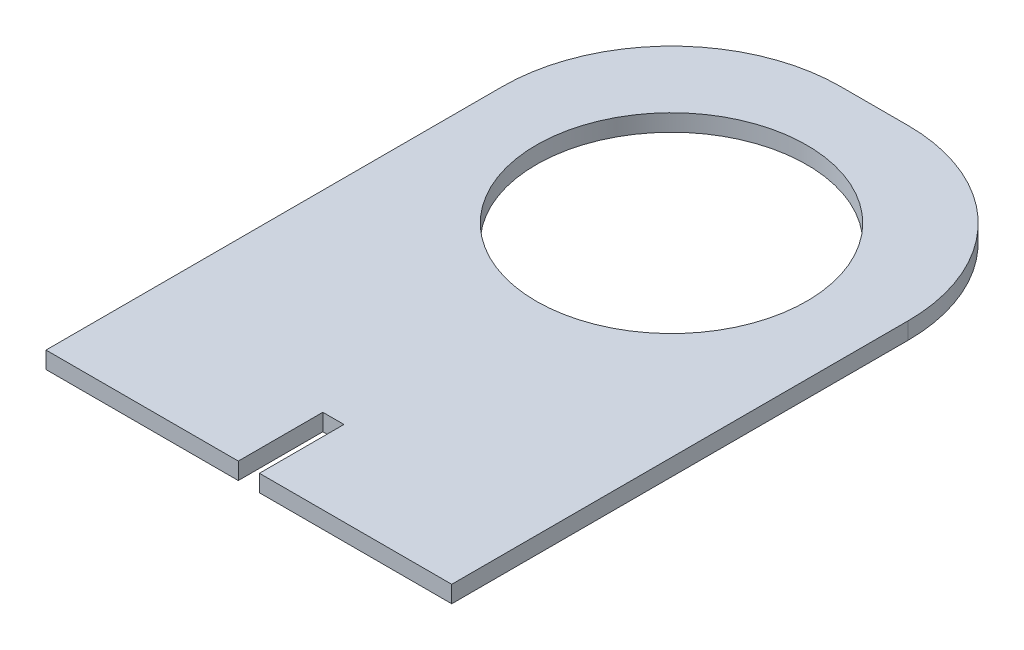
ISO-10303-21;
HEADER;
FILE_DESCRIPTION(('STEP AP214'),'2;1');
FILE_NAME('part.step','',(''),(''),'','','');
FILE_SCHEMA(('AUTOMOTIVE_DESIGN { 1 0 10303 214 1 1 1 1 }'));
ENDSEC;
DATA;
#1=APPLICATION_CONTEXT('core data for automotive mechanical design processes');
#2=APPLICATION_PROTOCOL_DEFINITION('international standard','automotive_design',2000,#1);
#3=PRODUCT_CONTEXT('',#1,'mechanical');
#4=PRODUCT('Part','Part','',(#3));
#5=PRODUCT_RELATED_PRODUCT_CATEGORY('part','',(#4));
#6=PRODUCT_DEFINITION_FORMATION('','',#4);
#7=PRODUCT_DEFINITION_CONTEXT('part definition',#1,'design');
#8=PRODUCT_DEFINITION('design','',#6,#7);
#9=PRODUCT_DEFINITION_SHAPE('','',#8);
#10=(LENGTH_UNIT() NAMED_UNIT(*) SI_UNIT(.MILLI.,.METRE.));
#11=(NAMED_UNIT(*) PLANE_ANGLE_UNIT() SI_UNIT($,.RADIAN.));
#12=(NAMED_UNIT(*) SI_UNIT($,.STERADIAN.) SOLID_ANGLE_UNIT());
#13=UNCERTAINTY_MEASURE_WITH_UNIT(LENGTH_MEASURE(1.E-05),#10,'distance_accuracy_value','');
#14=(GEOMETRIC_REPRESENTATION_CONTEXT(3) GLOBAL_UNCERTAINTY_ASSIGNED_CONTEXT((#13)) GLOBAL_UNIT_ASSIGNED_CONTEXT((#10,
#11,#12)) REPRESENTATION_CONTEXT('',''));
#15=CARTESIAN_POINT('',(0.,0.,0.));
#16=DIRECTION('',(0.,0.,1.));
#17=DIRECTION('',(1.,0.,0.));
#18=AXIS2_PLACEMENT_3D('',#15,#16,#17);
#19=CARTESIAN_POINT('',(0.,2.54,50.8));
#20=DIRECTION('',(0.,0.,1.));
#21=DIRECTION('',(1.,0.,0.));
#22=AXIS2_PLACEMENT_3D('',#19,#20,#21);
#23=PLANE('',#22);
#24=DIRECTION('',(-1.,0.,0.));
#25=VECTOR('',#24,1.);
#26=CARTESIAN_POINT('',(0.,0.,50.8));
#27=LINE('',#26,#25);
#28=CARTESIAN_POINT('',(1.5875,0.,50.8));
#29=VERTEX_POINT('',#28);
#30=CARTESIAN_POINT('',(-1.5875,0.,50.8));
#31=VERTEX_POINT('',#30);
#32=EDGE_CURVE('E126',#29,#31,#27,.T.);
#33=ORIENTED_EDGE('',*,*,#32,.F.);
#34=DIRECTION('',(0.,-1.,0.));
#35=VECTOR('',#34,1.);
#36=CARTESIAN_POINT('',(1.5875,2.54,50.8));
#37=LINE('',#36,#35);
#38=CARTESIAN_POINT('',(1.5875,2.54,50.8));
#39=VERTEX_POINT('',#38);
#40=EDGE_CURVE('E120',#39,#29,#37,.T.);
#41=ORIENTED_EDGE('',*,*,#40,.F.);
#42=DIRECTION('',(-1.,0.,0.));
#43=VECTOR('',#42,1.);
#44=CARTESIAN_POINT('',(0.,2.54,50.8));
#45=LINE('',#44,#43);
#46=CARTESIAN_POINT('',(-1.5875,2.54,50.8));
#47=VERTEX_POINT('',#46);
#48=EDGE_CURVE('E123',#39,#47,#45,.T.);
#49=ORIENTED_EDGE('',*,*,#48,.T.);
#50=DIRECTION('',(0.,-1.,0.));
#51=VECTOR('',#50,1.);
#52=CARTESIAN_POINT('',(-1.5875,2.54,50.8));
#53=LINE('',#52,#51);
#54=EDGE_CURVE('E176',#47,#31,#53,.T.);
#55=ORIENTED_EDGE('',*,*,#54,.T.);
#56=EDGE_LOOP('',(#33,#41,#49,#55));
#57=FACE_BOUND('',#56,.T.);
#58=ADVANCED_FACE('F41',(#57),#23,.T.);
#59=CARTESIAN_POINT('',(1.5875,2.54,0.));
#60=DIRECTION('',(1.,0.,0.));
#61=DIRECTION('',(0.,0.,-1.));
#62=AXIS2_PLACEMENT_3D('',#59,#60,#61);
#63=PLANE('',#62);
#64=DIRECTION('',(0.,0.,1.));
#65=VECTOR('',#64,1.);
#66=CARTESIAN_POINT('',(1.5875,0.,0.));
#67=LINE('',#66,#65);
#68=CARTESIAN_POINT('',(1.5875,0.,63.5));
#69=VERTEX_POINT('',#68);
#70=EDGE_CURVE('E179',#29,#69,#67,.T.);
#71=ORIENTED_EDGE('',*,*,#70,.T.);
#72=DIRECTION('',(0.,-1.,0.));
#73=VECTOR('',#72,1.);
#74=CARTESIAN_POINT('',(1.5875,2.54,63.5));
#75=LINE('',#74,#73);
#76=CARTESIAN_POINT('',(1.5875,2.54,63.5));
#77=VERTEX_POINT('',#76);
#78=EDGE_CURVE('E131',#77,#69,#75,.T.);
#79=ORIENTED_EDGE('',*,*,#78,.F.);
#80=DIRECTION('',(0.,0.,1.));
#81=VECTOR('',#80,1.);
#82=CARTESIAN_POINT('',(1.5875,2.54,0.));
#83=LINE('',#82,#81);
#84=EDGE_CURVE('E134',#39,#77,#83,.T.);
#85=ORIENTED_EDGE('',*,*,#84,.F.);
#86=ORIENTED_EDGE('',*,*,#40,.T.);
#87=EDGE_LOOP('',(#71,#79,#85,#86));
#88=FACE_BOUND('',#87,.T.);
#89=ADVANCED_FACE('F135',(#88),#63,.F.);
#90=CARTESIAN_POINT('',(0.,2.54,63.5));
#91=DIRECTION('',(0.,0.,-1.));
#92=DIRECTION('',(-1.,0.,0.));
#93=AXIS2_PLACEMENT_3D('',#90,#91,#92);
#94=PLANE('',#93);
#95=DIRECTION('',(1.,0.,0.));
#96=VECTOR('',#95,1.);
#97=CARTESIAN_POINT('',(0.,0.,63.5));
#98=LINE('',#97,#96);
#99=CARTESIAN_POINT('',(30.48,0.,63.5));
#100=VERTEX_POINT('',#99);
#101=EDGE_CURVE('E182',#69,#100,#98,.T.);
#102=ORIENTED_EDGE('',*,*,#101,.T.);
#103=DIRECTION('',(0.,-1.,0.));
#104=VECTOR('',#103,1.);
#105=CARTESIAN_POINT('',(30.48,2.54,63.5));
#106=LINE('',#105,#104);
#107=CARTESIAN_POINT('',(30.48,2.54,63.5));
#108=VERTEX_POINT('',#107);
#109=EDGE_CURVE('E211',#108,#100,#106,.T.);
#110=ORIENTED_EDGE('',*,*,#109,.F.);
#111=DIRECTION('',(1.,0.,0.));
#112=VECTOR('',#111,1.);
#113=CARTESIAN_POINT('',(0.,2.54,63.5));
#114=LINE('',#113,#112);
#115=EDGE_CURVE('E139',#77,#108,#114,.T.);
#116=ORIENTED_EDGE('',*,*,#115,.F.);
#117=ORIENTED_EDGE('',*,*,#78,.T.);
#118=EDGE_LOOP('',(#102,#110,#116,#117));
#119=FACE_BOUND('',#118,.T.);
#120=ADVANCED_FACE('F257',(#119),#94,.F.);
#121=CARTESIAN_POINT('',(30.48,2.54,0.));
#122=DIRECTION('',(-1.,0.,0.));
#123=DIRECTION('',(0.,0.,1.));
#124=AXIS2_PLACEMENT_3D('',#121,#122,#123);
#125=PLANE('',#124);
#126=DIRECTION('',(0.,0.,-1.));
#127=VECTOR('',#126,1.);
#128=CARTESIAN_POINT('',(30.48,0.,0.));
#129=LINE('',#128,#127);
#130=CARTESIAN_POINT('',(30.48,0.,-5.08));
#131=VERTEX_POINT('',#130);
#132=EDGE_CURVE('E185',#100,#131,#129,.T.);
#133=ORIENTED_EDGE('',*,*,#132,.T.);
#134=DIRECTION('',(0.,-1.,0.));
#135=VECTOR('',#134,1.);
#136=CARTESIAN_POINT('',(30.48,2.54,-5.08));
#137=LINE('',#136,#135);
#138=CARTESIAN_POINT('',(30.48,2.54,-5.08));
#139=VERTEX_POINT('',#138);
#140=EDGE_CURVE('E11',#131,#139,#137,.F.);
#141=ORIENTED_EDGE('',*,*,#140,.T.);
#142=DIRECTION('',(0.,0.,-1.));
#143=VECTOR('',#142,1.);
#144=CARTESIAN_POINT('',(30.48,2.54,0.));
#145=LINE('',#144,#143);
#146=EDGE_CURVE('E156',#108,#139,#145,.T.);
#147=ORIENTED_EDGE('',*,*,#146,.F.);
#148=ORIENTED_EDGE('',*,*,#109,.T.);
#149=EDGE_LOOP('',(#133,#141,#147,#148));
#150=FACE_BOUND('',#149,.T.);
#151=ADVANCED_FACE('F254',(#150),#125,.F.);
#152=CARTESIAN_POINT('',(0.,2.54,-30.48));
#153=DIRECTION('',(0.,0.,-1.));
#154=DIRECTION('',(-1.,0.,0.));
#155=AXIS2_PLACEMENT_3D('',#152,#153,#154);
#156=PLANE('',#155);
#157=DIRECTION('',(1.,0.,0.));
#158=VECTOR('',#157,1.);
#159=CARTESIAN_POINT('',(0.,0.,-30.48));
#160=LINE('',#159,#158);
#161=CARTESIAN_POINT('',(-5.07999999999999,0.,-30.48));
#162=VERTEX_POINT('',#161);
#163=CARTESIAN_POINT('',(5.08000000000001,0.,-30.48));
#164=VERTEX_POINT('',#163);
#165=EDGE_CURVE('E188',#162,#164,#160,.T.);
#166=ORIENTED_EDGE('',*,*,#165,.F.);
#167=DIRECTION('',(0.,-1.,0.));
#168=VECTOR('',#167,1.);
#169=CARTESIAN_POINT('',(-5.07999999999999,2.54,-30.48));
#170=LINE('',#169,#168);
#171=CARTESIAN_POINT('',(-5.07999999999999,2.54,-30.48));
#172=VERTEX_POINT('',#171);
#173=EDGE_CURVE('E230',#162,#172,#170,.F.);
#174=ORIENTED_EDGE('',*,*,#173,.T.);
#175=DIRECTION('',(1.,0.,0.));
#176=VECTOR('',#175,1.);
#177=CARTESIAN_POINT('',(0.,2.54,-30.48));
#178=LINE('',#177,#176);
#179=CARTESIAN_POINT('',(5.08000000000001,2.54,-30.48));
#180=VERTEX_POINT('',#179);
#181=EDGE_CURVE('E159',#172,#180,#178,.T.);
#182=ORIENTED_EDGE('',*,*,#181,.T.);
#183=DIRECTION('',(0.,-1.,0.));
#184=VECTOR('',#183,1.);
#185=CARTESIAN_POINT('',(5.08000000000001,0.,-30.48));
#186=LINE('',#185,#184);
#187=EDGE_CURVE('E226',#180,#164,#186,.T.);
#188=ORIENTED_EDGE('',*,*,#187,.T.);
#189=EDGE_LOOP('',(#166,#174,#182,#188));
#190=FACE_BOUND('',#189,.T.);
#191=ADVANCED_FACE('F249',(#190),#156,.T.);
#192=CARTESIAN_POINT('',(-30.48,2.54,0.));
#193=DIRECTION('',(-1.,0.,0.));
#194=DIRECTION('',(0.,0.,1.));
#195=AXIS2_PLACEMENT_3D('',#192,#193,#194);
#196=PLANE('',#195);
#197=DIRECTION('',(0.,0.,-1.));
#198=VECTOR('',#197,1.);
#199=CARTESIAN_POINT('',(-30.48,2.54,0.));
#200=LINE('',#199,#198);
#201=CARTESIAN_POINT('',(-30.48,2.54,63.5));
#202=VERTEX_POINT('',#201);
#203=CARTESIAN_POINT('',(-30.48,2.54,-5.08));
#204=VERTEX_POINT('',#203);
#205=EDGE_CURVE('E162',#202,#204,#200,.T.);
#206=ORIENTED_EDGE('',*,*,#205,.T.);
#207=DIRECTION('',(0.,-1.,0.));
#208=VECTOR('',#207,1.);
#209=CARTESIAN_POINT('',(-30.48,2.54,-5.08));
#210=LINE('',#209,#208);
#211=CARTESIAN_POINT('',(-30.48,0.,-5.08));
#212=VERTEX_POINT('',#211);
#213=EDGE_CURVE('E130',#204,#212,#210,.T.);
#214=ORIENTED_EDGE('',*,*,#213,.T.);
#215=DIRECTION('',(0.,0.,-1.));
#216=VECTOR('',#215,1.);
#217=CARTESIAN_POINT('',(-30.48,0.,0.));
#218=LINE('',#217,#216);
#219=CARTESIAN_POINT('',(-30.48,0.,63.5));
#220=VERTEX_POINT('',#219);
#221=EDGE_CURVE('E192',#220,#212,#218,.T.);
#222=ORIENTED_EDGE('',*,*,#221,.F.);
#223=DIRECTION('',(0.,-1.,0.));
#224=VECTOR('',#223,1.);
#225=CARTESIAN_POINT('',(-30.48,2.54,63.5));
#226=LINE('',#225,#224);
#227=EDGE_CURVE('E208',#202,#220,#226,.T.);
#228=ORIENTED_EDGE('',*,*,#227,.F.);
#229=EDGE_LOOP('',(#206,#214,#222,#228));
#230=FACE_BOUND('',#229,.T.);
#231=ADVANCED_FACE('F241',(#230),#196,.T.);
#232=CARTESIAN_POINT('',(0.,2.54,63.5));
#233=DIRECTION('',(0.,0.,1.));
#234=DIRECTION('',(1.,0.,0.));
#235=AXIS2_PLACEMENT_3D('',#232,#233,#234);
#236=PLANE('',#235);
#237=DIRECTION('',(-1.,0.,0.));
#238=VECTOR('',#237,1.);
#239=CARTESIAN_POINT('',(0.,0.,63.5));
#240=LINE('',#239,#238);
#241=CARTESIAN_POINT('',(-1.5875,0.,63.5));
#242=VERTEX_POINT('',#241);
#243=EDGE_CURVE('E196',#242,#220,#240,.T.);
#244=ORIENTED_EDGE('',*,*,#243,.F.);
#245=DIRECTION('',(0.,-1.,0.));
#246=VECTOR('',#245,1.);
#247=CARTESIAN_POINT('',(-1.5875,2.54,63.5));
#248=LINE('',#247,#246);
#249=CARTESIAN_POINT('',(-1.5875,2.54,63.5));
#250=VERTEX_POINT('',#249);
#251=EDGE_CURVE('E205',#250,#242,#248,.T.);
#252=ORIENTED_EDGE('',*,*,#251,.F.);
#253=DIRECTION('',(-1.,0.,0.));
#254=VECTOR('',#253,1.);
#255=CARTESIAN_POINT('',(0.,2.54,63.5));
#256=LINE('',#255,#254);
#257=EDGE_CURVE('E166',#250,#202,#256,.T.);
#258=ORIENTED_EDGE('',*,*,#257,.T.);
#259=ORIENTED_EDGE('',*,*,#227,.T.);
#260=EDGE_LOOP('',(#244,#252,#258,#259));
#261=FACE_BOUND('',#260,.T.);
#262=ADVANCED_FACE('F263',(#261),#236,.T.);
#263=CARTESIAN_POINT('',(-1.5875,2.54,0.));
#264=DIRECTION('',(1.,0.,0.));
#265=DIRECTION('',(0.,0.,-1.));
#266=AXIS2_PLACEMENT_3D('',#263,#264,#265);
#267=PLANE('',#266);
#268=DIRECTION('',(0.,0.,1.));
#269=VECTOR('',#268,1.);
#270=CARTESIAN_POINT('',(-1.5875,0.,0.));
#271=LINE('',#270,#269);
#272=EDGE_CURVE('E151',#31,#242,#271,.T.);
#273=ORIENTED_EDGE('',*,*,#272,.F.);
#274=ORIENTED_EDGE('',*,*,#54,.F.);
#275=DIRECTION('',(0.,0.,1.));
#276=VECTOR('',#275,1.);
#277=CARTESIAN_POINT('',(-1.5875,2.54,0.));
#278=LINE('',#277,#276);
#279=EDGE_CURVE('E145',#47,#250,#278,.T.);
#280=ORIENTED_EDGE('',*,*,#279,.T.);
#281=ORIENTED_EDGE('',*,*,#251,.T.);
#282=EDGE_LOOP('',(#273,#274,#280,#281));
#283=FACE_BOUND('',#282,.T.);
#284=ADVANCED_FACE('F260',(#283),#267,.T.);
#285=CARTESIAN_POINT('',(0.,2.54,0.));
#286=DIRECTION('',(0.,-1.,0.));
#287=DIRECTION('',(0.,0.,-1.));
#288=AXIS2_PLACEMENT_3D('',#285,#286,#287);
#289=CYLINDRICAL_SURFACE('',#288,20.32);
#290=CARTESIAN_POINT('',(0.,2.54,0.));
#291=DIRECTION('',(0.,1.,0.));
#292=DIRECTION('',(0.,0.,1.));
#293=AXIS2_PLACEMENT_3D('',#290,#291,#292);
#294=CIRCLE('',#293,20.32);
#295=CARTESIAN_POINT('',(0.,2.54,20.32));
#296=VERTEX_POINT('',#295);
#297=EDGE_CURVE('E172',#296,#296,#294,.T.);
#298=ORIENTED_EDGE('',*,*,#297,.T.);
#299=EDGE_LOOP('',(#298));
#300=FACE_BOUND('',#299,.T.);
#301=CARTESIAN_POINT('',(0.,0.,0.));
#302=DIRECTION('',(0.,1.,0.));
#303=DIRECTION('',(0.,0.,1.));
#304=AXIS2_PLACEMENT_3D('',#301,#302,#303);
#305=CIRCLE('',#304,20.32);
#306=CARTESIAN_POINT('',(0.,0.,20.32));
#307=VERTEX_POINT('',#306);
#308=EDGE_CURVE('E147',#307,#307,#305,.T.);
#309=ORIENTED_EDGE('',*,*,#308,.F.);
#310=EDGE_LOOP('',(#309));
#311=FACE_BOUND('',#310,.T.);
#312=ADVANCED_FACE('F270',(#300,#311),#289,.F.);
#313=CARTESIAN_POINT('',(0.,2.54,0.));
#314=DIRECTION('',(0.,1.,0.));
#315=DIRECTION('',(0.,0.,1.));
#316=AXIS2_PLACEMENT_3D('',#313,#314,#315);
#317=PLANE('',#316);
#318=ORIENTED_EDGE('',*,*,#181,.F.);
#319=CARTESIAN_POINT('',(-5.07999999999999,2.54,-5.08));
#320=DIRECTION('',(0.,1.,0.));
#321=DIRECTION('',(0.,0.,1.));
#322=AXIS2_PLACEMENT_3D('',#319,#320,#321);
#323=CIRCLE('',#322,25.4);
#324=EDGE_CURVE('E50',#172,#204,#323,.T.);
#325=ORIENTED_EDGE('',*,*,#324,.T.);
#326=ORIENTED_EDGE('',*,*,#205,.F.);
#327=ORIENTED_EDGE('',*,*,#257,.F.);
#328=ORIENTED_EDGE('',*,*,#279,.F.);
#329=ORIENTED_EDGE('',*,*,#48,.F.);
#330=ORIENTED_EDGE('',*,*,#84,.T.);
#331=ORIENTED_EDGE('',*,*,#115,.T.);
#332=ORIENTED_EDGE('',*,*,#146,.T.);
#333=CARTESIAN_POINT('',(5.08000000000001,2.54,-5.08));
#334=DIRECTION('',(0.,1.,0.));
#335=DIRECTION('',(0.,0.,1.));
#336=AXIS2_PLACEMENT_3D('',#333,#334,#335);
#337=CIRCLE('',#336,25.4);
#338=EDGE_CURVE('E62',#139,#180,#337,.T.);
#339=ORIENTED_EDGE('',*,*,#338,.T.);
#340=EDGE_LOOP('',(#318,#325,#326,#327,#328,#329,#330,#331,#332,#339));
#341=FACE_BOUND('',#340,.T.);
#342=ORIENTED_EDGE('',*,*,#297,.F.);
#343=EDGE_LOOP('',(#342));
#344=FACE_BOUND('',#343,.T.);
#345=ADVANCED_FACE('F141',(#341,#344),#317,.T.);
#346=CARTESIAN_POINT('',(0.,0.,0.));
#347=DIRECTION('',(0.,1.,0.));
#348=DIRECTION('',(0.,0.,1.));
#349=AXIS2_PLACEMENT_3D('',#346,#347,#348);
#350=PLANE('',#349);
#351=ORIENTED_EDGE('',*,*,#221,.T.);
#352=CARTESIAN_POINT('',(-5.07999999999999,0.,-5.08));
#353=DIRECTION('',(0.,1.,0.));
#354=DIRECTION('',(0.,0.,1.));
#355=AXIS2_PLACEMENT_3D('',#352,#353,#354);
#356=CIRCLE('',#355,25.4);
#357=EDGE_CURVE('E223',#212,#162,#356,.F.);
#358=ORIENTED_EDGE('',*,*,#357,.T.);
#359=ORIENTED_EDGE('',*,*,#165,.T.);
#360=CARTESIAN_POINT('',(5.08000000000001,0.,-5.08));
#361=DIRECTION('',(0.,1.,0.));
#362=DIRECTION('',(0.,0.,1.));
#363=AXIS2_PLACEMENT_3D('',#360,#361,#362);
#364=CIRCLE('',#363,25.4);
#365=EDGE_CURVE('E220',#164,#131,#364,.F.);
#366=ORIENTED_EDGE('',*,*,#365,.T.);
#367=ORIENTED_EDGE('',*,*,#132,.F.);
#368=ORIENTED_EDGE('',*,*,#101,.F.);
#369=ORIENTED_EDGE('',*,*,#70,.F.);
#370=ORIENTED_EDGE('',*,*,#32,.T.);
#371=ORIENTED_EDGE('',*,*,#272,.T.);
#372=ORIENTED_EDGE('',*,*,#243,.T.);
#373=EDGE_LOOP('',(#351,#358,#359,#366,#367,#368,#369,#370,#371,#372));
#374=FACE_BOUND('',#373,.T.);
#375=ORIENTED_EDGE('',*,*,#308,.T.);
#376=EDGE_LOOP('',(#375));
#377=FACE_BOUND('',#376,.T.);
#378=ADVANCED_FACE('F246',(#374,#377),#350,.F.);
#379=CARTESIAN_POINT('',(-5.07999999999999,2.54,-5.08));
#380=DIRECTION('',(0.,-1.,0.));
#381=DIRECTION('',(0.,0.,-1.));
#382=AXIS2_PLACEMENT_3D('',#379,#380,#381);
#383=CYLINDRICAL_SURFACE('',#382,25.4);
#384=ORIENTED_EDGE('',*,*,#324,.F.);
#385=ORIENTED_EDGE('',*,*,#173,.F.);
#386=ORIENTED_EDGE('',*,*,#357,.F.);
#387=ORIENTED_EDGE('',*,*,#213,.F.);
#388=EDGE_LOOP('',(#384,#385,#386,#387));
#389=FACE_BOUND('',#388,.T.);
#390=ADVANCED_FACE('F243',(#389),#383,.T.);
#391=CARTESIAN_POINT('',(5.08000000000001,2.54,-5.08));
#392=DIRECTION('',(0.,1.,0.));
#393=DIRECTION('',(0.,0.,1.));
#394=AXIS2_PLACEMENT_3D('',#391,#392,#393);
#395=CYLINDRICAL_SURFACE('',#394,25.4);
#396=ORIENTED_EDGE('',*,*,#338,.F.);
#397=ORIENTED_EDGE('',*,*,#140,.F.);
#398=ORIENTED_EDGE('',*,*,#365,.F.);
#399=ORIENTED_EDGE('',*,*,#187,.F.);
#400=EDGE_LOOP('',(#396,#397,#398,#399));
#401=FACE_BOUND('',#400,.T.);
#402=ADVANCED_FACE('F43',(#401),#395,.T.);
#403=CLOSED_SHELL('',(#58,#89,#120,#151,#191,#231,#262,#284,#312,#345,#378,#390,#402));
#404=MANIFOLD_SOLID_BREP('B2',#403);
#405=ADVANCED_BREP_SHAPE_REPRESENTATION('',(#18,#404),#14);
#406=SHAPE_DEFINITION_REPRESENTATION(#9,#405);
ENDSEC;
END-ISO-10303-21;
